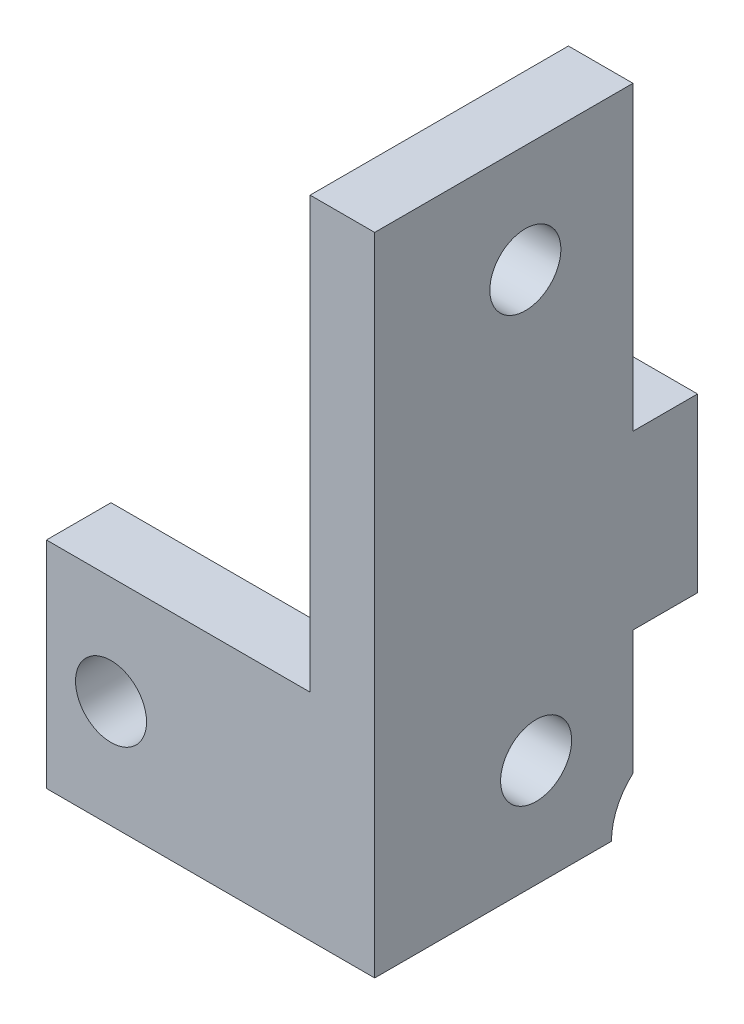
ISO-10303-21;
HEADER;
FILE_DESCRIPTION(('STEP AP214'),'2;1');
FILE_NAME('part.step','',(''),(''),'','','');
FILE_SCHEMA(('AUTOMOTIVE_DESIGN { 1 0 10303 214 1 1 1 1 }'));
ENDSEC;
DATA;
#1=APPLICATION_CONTEXT('core data for automotive mechanical design processes');
#2=APPLICATION_PROTOCOL_DEFINITION('international standard','automotive_design',2000,#1);
#3=PRODUCT_CONTEXT('',#1,'mechanical');
#4=PRODUCT('Part','Part','',(#3));
#5=PRODUCT_RELATED_PRODUCT_CATEGORY('part','',(#4));
#6=PRODUCT_DEFINITION_FORMATION('','',#4);
#7=PRODUCT_DEFINITION_CONTEXT('part definition',#1,'design');
#8=PRODUCT_DEFINITION('design','',#6,#7);
#9=PRODUCT_DEFINITION_SHAPE('','',#8);
#10=(LENGTH_UNIT() NAMED_UNIT(*) SI_UNIT(.MILLI.,.METRE.));
#11=(NAMED_UNIT(*) PLANE_ANGLE_UNIT() SI_UNIT($,.RADIAN.));
#12=(NAMED_UNIT(*) SI_UNIT($,.STERADIAN.) SOLID_ANGLE_UNIT());
#13=UNCERTAINTY_MEASURE_WITH_UNIT(LENGTH_MEASURE(1.E-05),#10,'distance_accuracy_value','');
#14=(GEOMETRIC_REPRESENTATION_CONTEXT(3) GLOBAL_UNCERTAINTY_ASSIGNED_CONTEXT((#13)) GLOBAL_UNIT_ASSIGNED_CONTEXT((#10,
#11,#12)) REPRESENTATION_CONTEXT('',''));
#15=CARTESIAN_POINT('',(0.,0.,0.));
#16=DIRECTION('',(0.,0.,1.));
#17=DIRECTION('',(1.,0.,0.));
#18=AXIS2_PLACEMENT_3D('',#15,#16,#17);
#19=CARTESIAN_POINT('',(-3.00100000000001,25.,-9.));
#20=DIRECTION('',(0.,0.,1.));
#21=DIRECTION('',(0.,-1.,0.));
#22=AXIS2_PLACEMENT_3D('',#19,#20,#21);
#23=PLANE('',#22);
#24=DIRECTION('',(1.,0.,0.));
#25=VECTOR('',#24,1.);
#26=CARTESIAN_POINT('',(-2.75,11.,-9.));
#27=LINE('',#26,#25);
#28=CARTESIAN_POINT('',(9.25,11.,-9.));
#29=VERTEX_POINT('',#28);
#30=CARTESIAN_POINT('',(12.25,11.,-9.));
#31=VERTEX_POINT('',#30);
#32=EDGE_CURVE('E11',#29,#31,#27,.T.);
#33=ORIENTED_EDGE('',*,*,#32,.F.);
#34=DIRECTION('',(0.,-1.,0.));
#35=VECTOR('',#34,1.);
#36=CARTESIAN_POINT('',(9.25,25.,-9.));
#37=LINE('',#36,#35);
#38=CARTESIAN_POINT('',(9.24999999999999,25.,-8.99999999999999));
#39=VERTEX_POINT('',#38);
#40=EDGE_CURVE('E177',#39,#29,#37,.T.);
#41=ORIENTED_EDGE('',*,*,#40,.F.);
#42=DIRECTION('',(1.,0.,0.));
#43=VECTOR('',#42,1.);
#44=CARTESIAN_POINT('',(-3.00100000000001,25.,-9.));
#45=LINE('',#44,#43);
#46=CARTESIAN_POINT('',(12.25,25.,-9.));
#47=VERTEX_POINT('',#46);
#48=EDGE_CURVE('E184',#39,#47,#45,.T.);
#49=ORIENTED_EDGE('',*,*,#48,.T.);
#50=DIRECTION('',(0.,-1.,0.));
#51=VECTOR('',#50,1.);
#52=CARTESIAN_POINT('',(12.25,25.,-9.));
#53=LINE('',#52,#51);
#54=EDGE_CURVE('E181',#47,#31,#53,.T.);
#55=ORIENTED_EDGE('',*,*,#54,.T.);
#56=EDGE_LOOP('',(#33,#41,#49,#55));
#57=FACE_BOUND('',#56,.T.);
#58=ADVANCED_FACE('F41',(#57),#23,.F.);
#59=CARTESIAN_POINT('',(0.,5.,3.));
#60=DIRECTION('',(0.,1.,0.));
#61=DIRECTION('',(-1.,0.,0.));
#62=AXIS2_PLACEMENT_3D('',#59,#60,#61);
#63=PLANE('',#62);
#64=DIRECTION('',(1.,0.,0.));
#65=VECTOR('',#64,1.);
#66=CARTESIAN_POINT('',(0.,5.,3.));
#67=LINE('',#66,#65);
#68=CARTESIAN_POINT('',(-3.,5.,3.));
#69=VERTEX_POINT('',#68);
#70=CARTESIAN_POINT('',(9.25,5.,3.));
#71=VERTEX_POINT('',#70);
#72=EDGE_CURVE('E229',#69,#71,#67,.T.);
#73=ORIENTED_EDGE('',*,*,#72,.T.);
#74=DIRECTION('',(0.,0.,-1.));
#75=VECTOR('',#74,1.);
#76=CARTESIAN_POINT('',(9.25,5.,3.));
#77=LINE('',#76,#75);
#78=CARTESIAN_POINT('',(9.25,5.,0.));
#79=VERTEX_POINT('',#78);
#80=EDGE_CURVE('E203',#71,#79,#77,.T.);
#81=ORIENTED_EDGE('',*,*,#80,.T.);
#82=DIRECTION('',(1.,0.,0.));
#83=VECTOR('',#82,1.);
#84=CARTESIAN_POINT('',(0.,5.,0.));
#85=LINE('',#84,#83);
#86=CARTESIAN_POINT('',(-3.,5.,0.));
#87=VERTEX_POINT('',#86);
#88=EDGE_CURVE('E244',#87,#79,#85,.T.);
#89=ORIENTED_EDGE('',*,*,#88,.F.);
#90=DIRECTION('',(0.,0.,-1.));
#91=VECTOR('',#90,1.);
#92=CARTESIAN_POINT('',(-3.,5.,3.));
#93=LINE('',#92,#91);
#94=EDGE_CURVE('E45',#69,#87,#93,.T.);
#95=ORIENTED_EDGE('',*,*,#94,.F.);
#96=EDGE_LOOP('',(#73,#81,#89,#95));
#97=FACE_BOUND('',#96,.T.);
#98=ADVANCED_FACE('F293',(#97),#63,.T.);
#99=CARTESIAN_POINT('',(-3.,0.,3.));
#100=DIRECTION('',(1.,0.,0.));
#101=DIRECTION('',(0.,1.,0.));
#102=AXIS2_PLACEMENT_3D('',#99,#100,#101);
#103=PLANE('',#102);
#104=DIRECTION('',(0.,-1.,0.));
#105=VECTOR('',#104,1.);
#106=CARTESIAN_POINT('',(-3.,0.,0.));
#107=LINE('',#106,#105);
#108=CARTESIAN_POINT('',(-3.,-5.,0.));
#109=VERTEX_POINT('',#108);
#110=EDGE_CURVE('E246',#87,#109,#107,.T.);
#111=ORIENTED_EDGE('',*,*,#110,.T.);
#112=DIRECTION('',(0.,0.,-1.));
#113=VECTOR('',#112,1.);
#114=CARTESIAN_POINT('',(-3.,-5.,3.));
#115=LINE('',#114,#113);
#116=CARTESIAN_POINT('',(-3.,-5.,3.));
#117=VERTEX_POINT('',#116);
#118=EDGE_CURVE('E238',#117,#109,#115,.T.);
#119=ORIENTED_EDGE('',*,*,#118,.F.);
#120=DIRECTION('',(0.,-1.,0.));
#121=VECTOR('',#120,1.);
#122=CARTESIAN_POINT('',(-3.,0.,3.));
#123=LINE('',#122,#121);
#124=EDGE_CURVE('E232',#69,#117,#123,.T.);
#125=ORIENTED_EDGE('',*,*,#124,.F.);
#126=ORIENTED_EDGE('',*,*,#94,.T.);
#127=EDGE_LOOP('',(#111,#119,#125,#126));
#128=FACE_BOUND('',#127,.T.);
#129=ADVANCED_FACE('F294',(#128),#103,.F.);
#130=CARTESIAN_POINT('',(0.,0.,3.));
#131=DIRECTION('',(0.,0.,-1.));
#132=DIRECTION('',(-1.,0.,0.));
#133=AXIS2_PLACEMENT_3D('',#130,#131,#132);
#134=CYLINDRICAL_SURFACE('',#133,1.65);
#135=CARTESIAN_POINT('',(0.,0.,3.));
#136=DIRECTION('',(0.,0.,1.));
#137=DIRECTION('',(1.,0.,0.));
#138=AXIS2_PLACEMENT_3D('',#135,#136,#137);
#139=CIRCLE('',#138,1.65);
#140=CARTESIAN_POINT('',(1.65,0.,3.));
#141=VERTEX_POINT('',#140);
#142=EDGE_CURVE('E226',#141,#141,#139,.T.);
#143=ORIENTED_EDGE('',*,*,#142,.T.);
#144=EDGE_LOOP('',(#143));
#145=FACE_BOUND('',#144,.T.);
#146=CARTESIAN_POINT('',(0.,0.,0.));
#147=DIRECTION('',(0.,0.,1.));
#148=DIRECTION('',(1.,0.,0.));
#149=AXIS2_PLACEMENT_3D('',#146,#147,#148);
#150=CIRCLE('',#149,1.65);
#151=CARTESIAN_POINT('',(1.65,0.,0.));
#152=VERTEX_POINT('',#151);
#153=EDGE_CURVE('E224',#152,#152,#150,.T.);
#154=ORIENTED_EDGE('',*,*,#153,.F.);
#155=EDGE_LOOP('',(#154));
#156=FACE_BOUND('',#155,.T.);
#157=ADVANCED_FACE('F43',(#145,#156),#134,.F.);
#158=CARTESIAN_POINT('',(0.,-5.,3.));
#159=DIRECTION('',(0.,1.,0.));
#160=DIRECTION('',(-1.,0.,0.));
#161=AXIS2_PLACEMENT_3D('',#158,#159,#160);
#162=PLANE('',#161);
#163=DIRECTION('',(0.,0.,1.));
#164=VECTOR('',#163,1.);
#165=CARTESIAN_POINT('',(9.25,-5.,-11.));
#166=LINE('',#165,#164);
#167=CARTESIAN_POINT('',(9.25000000000001,-5.,-8.));
#168=VERTEX_POINT('',#167);
#169=CARTESIAN_POINT('',(9.25,-5.,0.));
#170=VERTEX_POINT('',#169);
#171=EDGE_CURVE('E221',#168,#170,#166,.T.);
#172=ORIENTED_EDGE('',*,*,#171,.F.);
#173=DIRECTION('',(1.,0.,0.));
#174=VECTOR('',#173,1.);
#175=CARTESIAN_POINT('',(9.25000000000001,-5.,-8.));
#176=LINE('',#175,#174);
#177=CARTESIAN_POINT('',(12.25,-5.,-8.));
#178=VERTEX_POINT('',#177);
#179=EDGE_CURVE('E189',#168,#178,#176,.T.);
#180=ORIENTED_EDGE('',*,*,#179,.T.);
#181=DIRECTION('',(0.,0.,1.));
#182=VECTOR('',#181,1.);
#183=CARTESIAN_POINT('',(12.25,-5.,-11.));
#184=LINE('',#183,#182);
#185=CARTESIAN_POINT('',(12.25,-5.,3.));
#186=VERTEX_POINT('',#185);
#187=EDGE_CURVE('E222',#178,#186,#184,.T.);
#188=ORIENTED_EDGE('',*,*,#187,.T.);
#189=DIRECTION('',(1.,0.,0.));
#190=VECTOR('',#189,1.);
#191=CARTESIAN_POINT('',(0.,-5.,3.));
#192=LINE('',#191,#190);
#193=EDGE_CURVE('E235',#117,#186,#192,.T.);
#194=ORIENTED_EDGE('',*,*,#193,.F.);
#195=ORIENTED_EDGE('',*,*,#118,.T.);
#196=DIRECTION('',(1.,0.,0.));
#197=VECTOR('',#196,1.);
#198=CARTESIAN_POINT('',(0.,-5.,0.));
#199=LINE('',#198,#197);
#200=EDGE_CURVE('E230',#109,#170,#199,.T.);
#201=ORIENTED_EDGE('',*,*,#200,.T.);
#202=EDGE_LOOP('',(#172,#180,#188,#194,#195,#201));
#203=FACE_BOUND('',#202,.T.);
#204=ADVANCED_FACE('F270',(#203),#162,.F.);
#205=CARTESIAN_POINT('',(0.,0.,3.));
#206=DIRECTION('',(0.,0.,1.));
#207=DIRECTION('',(1.,0.,0.));
#208=AXIS2_PLACEMENT_3D('',#205,#206,#207);
#209=PLANE('',#208);
#210=ORIENTED_EDGE('',*,*,#142,.F.);
#211=EDGE_LOOP('',(#210));
#212=FACE_BOUND('',#211,.T.);
#213=ORIENTED_EDGE('',*,*,#193,.T.);
#214=DIRECTION('',(0.,1.,0.));
#215=VECTOR('',#214,1.);
#216=CARTESIAN_POINT('',(12.25,5.,3.));
#217=LINE('',#216,#215);
#218=CARTESIAN_POINT('',(12.25,25.,3.));
#219=VERTEX_POINT('',#218);
#220=EDGE_CURVE('E218',#186,#219,#217,.T.);
#221=ORIENTED_EDGE('',*,*,#220,.T.);
#222=DIRECTION('',(1.,0.,0.));
#223=VECTOR('',#222,1.);
#224=CARTESIAN_POINT('',(9.24999999999999,25.,3.));
#225=LINE('',#224,#223);
#226=CARTESIAN_POINT('',(9.24999999999999,25.,3.));
#227=VERTEX_POINT('',#226);
#228=EDGE_CURVE('E208',#227,#219,#225,.T.);
#229=ORIENTED_EDGE('',*,*,#228,.F.);
#230=DIRECTION('',(0.,-1.,0.));
#231=VECTOR('',#230,1.);
#232=CARTESIAN_POINT('',(9.25,5.,3.));
#233=LINE('',#232,#231);
#234=EDGE_CURVE('E200',#227,#71,#233,.T.);
#235=ORIENTED_EDGE('',*,*,#234,.T.);
#236=ORIENTED_EDGE('',*,*,#72,.F.);
#237=ORIENTED_EDGE('',*,*,#124,.T.);
#238=EDGE_LOOP('',(#213,#221,#229,#235,#236,#237));
#239=FACE_BOUND('',#238,.T.);
#240=ADVANCED_FACE('F289',(#212,#239),#209,.T.);
#241=CARTESIAN_POINT('',(0.,0.,0.));
#242=DIRECTION('',(0.,0.,1.));
#243=DIRECTION('',(1.,0.,0.));
#244=AXIS2_PLACEMENT_3D('',#241,#242,#243);
#245=PLANE('',#244);
#246=ORIENTED_EDGE('',*,*,#153,.T.);
#247=EDGE_LOOP('',(#246));
#248=FACE_BOUND('',#247,.T.);
#249=DIRECTION('',(0.,-1.,0.));
#250=VECTOR('',#249,1.);
#251=CARTESIAN_POINT('',(9.25,0.,0.));
#252=LINE('',#251,#250);
#253=EDGE_CURVE('E241',#79,#170,#252,.T.);
#254=ORIENTED_EDGE('',*,*,#253,.T.);
#255=ORIENTED_EDGE('',*,*,#200,.F.);
#256=ORIENTED_EDGE('',*,*,#110,.F.);
#257=ORIENTED_EDGE('',*,*,#88,.T.);
#258=EDGE_LOOP('',(#254,#255,#256,#257));
#259=FACE_BOUND('',#258,.T.);
#260=ADVANCED_FACE('F296',(#248,#259),#245,.F.);
#261=CARTESIAN_POINT('',(9.25,5.,-11.));
#262=DIRECTION('',(-1.,0.,0.));
#263=DIRECTION('',(0.,-1.,0.));
#264=AXIS2_PLACEMENT_3D('',#261,#262,#263);
#265=PLANE('',#264);
#266=ORIENTED_EDGE('',*,*,#40,.T.);
#267=CARTESIAN_POINT('',(9.25,3.,-9.));
#268=VERTEX_POINT('',#267);
#269=EDGE_CURVE('E180',#29,#268,#37,.T.);
#270=ORIENTED_EDGE('',*,*,#269,.T.);
#271=CARTESIAN_POINT('',(9.25000000000001,-2.76393202250021,-9.));
#272=VERTEX_POINT('',#271);
#273=EDGE_CURVE('E176',#268,#272,#37,.T.);
#274=ORIENTED_EDGE('',*,*,#273,.T.);
#275=CARTESIAN_POINT('',(9.25000000000001,-5.,-11.));
#276=DIRECTION('',(1.,0.,0.));
#277=DIRECTION('',(0.,-1.,0.));
#278=AXIS2_PLACEMENT_3D('',#275,#276,#277);
#279=CIRCLE('',#278,3.);
#280=EDGE_CURVE('E187',#272,#168,#279,.T.);
#281=ORIENTED_EDGE('',*,*,#280,.T.);
#282=ORIENTED_EDGE('',*,*,#171,.T.);
#283=ORIENTED_EDGE('',*,*,#253,.F.);
#284=ORIENTED_EDGE('',*,*,#80,.F.);
#285=ORIENTED_EDGE('',*,*,#234,.F.);
#286=DIRECTION('',(0.,0.,1.));
#287=VECTOR('',#286,1.);
#288=CARTESIAN_POINT('',(9.24999999999999,25.,3.));
#289=LINE('',#288,#287);
#290=EDGE_CURVE('E206',#39,#227,#289,.T.);
#291=ORIENTED_EDGE('',*,*,#290,.F.);
#292=EDGE_LOOP('',(#266,#270,#274,#281,#282,#283,#284,#285,#291));
#293=FACE_BOUND('',#292,.T.);
#294=CARTESIAN_POINT('',(9.25,0.,-4.5));
#295=DIRECTION('',(-1.,0.,0.));
#296=DIRECTION('',(0.,-1.,0.));
#297=AXIS2_PLACEMENT_3D('',#294,#295,#296);
#298=CIRCLE('',#297,1.65);
#299=CARTESIAN_POINT('',(9.25,-1.65,-4.5));
#300=VERTEX_POINT('',#299);
#301=EDGE_CURVE('E215',#300,#300,#298,.T.);
#302=ORIENTED_EDGE('',*,*,#301,.F.);
#303=EDGE_LOOP('',(#302));
#304=FACE_BOUND('',#303,.T.);
#305=CARTESIAN_POINT('',(9.24999999999999,20.,-4.));
#306=DIRECTION('',(1.,0.,0.));
#307=DIRECTION('',(0.,1.,0.));
#308=AXIS2_PLACEMENT_3D('',#305,#306,#307);
#309=CIRCLE('',#308,1.65);
#310=CARTESIAN_POINT('',(9.24999999999999,21.65,-4.));
#311=VERTEX_POINT('',#310);
#312=EDGE_CURVE('E194',#311,#311,#309,.T.);
#313=ORIENTED_EDGE('',*,*,#312,.T.);
#314=EDGE_LOOP('',(#313));
#315=FACE_BOUND('',#314,.T.);
#316=ADVANCED_FACE('F273',(#293,#304,#315),#265,.T.);
#317=CARTESIAN_POINT('',(12.25,5.,-11.));
#318=DIRECTION('',(1.,0.,0.));
#319=DIRECTION('',(0.,1.,0.));
#320=AXIS2_PLACEMENT_3D('',#317,#318,#319);
#321=PLANE('',#320);
#322=ORIENTED_EDGE('',*,*,#54,.F.);
#323=DIRECTION('',(0.,0.,1.));
#324=VECTOR('',#323,1.);
#325=CARTESIAN_POINT('',(12.25,25.,3.));
#326=LINE('',#325,#324);
#327=EDGE_CURVE('E197',#47,#219,#326,.T.);
#328=ORIENTED_EDGE('',*,*,#327,.T.);
#329=ORIENTED_EDGE('',*,*,#220,.F.);
#330=ORIENTED_EDGE('',*,*,#187,.F.);
#331=CARTESIAN_POINT('',(12.25,-5.,-11.));
#332=DIRECTION('',(1.,0.,0.));
#333=DIRECTION('',(0.,-1.,0.));
#334=AXIS2_PLACEMENT_3D('',#331,#332,#333);
#335=CIRCLE('',#334,3.);
#336=CARTESIAN_POINT('',(12.25,-2.76393202250021,-9.));
#337=VERTEX_POINT('',#336);
#338=EDGE_CURVE('E186',#337,#178,#335,.T.);
#339=ORIENTED_EDGE('',*,*,#338,.F.);
#340=CARTESIAN_POINT('',(12.25,3.,-9.));
#341=VERTEX_POINT('',#340);
#342=EDGE_CURVE('E66',#341,#337,#53,.T.);
#343=ORIENTED_EDGE('',*,*,#342,.F.);
#344=DIRECTION('',(0.,0.,-1.));
#345=VECTOR('',#344,1.);
#346=CARTESIAN_POINT('',(12.25,3.,-9.));
#347=LINE('',#346,#345);
#348=CARTESIAN_POINT('',(12.25,3.,-12.));
#349=VERTEX_POINT('',#348);
#350=EDGE_CURVE('E59',#341,#349,#347,.T.);
#351=ORIENTED_EDGE('',*,*,#350,.T.);
#352=DIRECTION('',(0.,1.,0.));
#353=VECTOR('',#352,1.);
#354=CARTESIAN_POINT('',(12.25,11.,-12.));
#355=LINE('',#354,#353);
#356=CARTESIAN_POINT('',(12.25,11.,-12.));
#357=VERTEX_POINT('',#356);
#358=EDGE_CURVE('E163',#349,#357,#355,.T.);
#359=ORIENTED_EDGE('',*,*,#358,.T.);
#360=DIRECTION('',(0.,0.,1.));
#361=VECTOR('',#360,1.);
#362=CARTESIAN_POINT('',(12.25,11.,-9.));
#363=LINE('',#362,#361);
#364=EDGE_CURVE('E160',#357,#31,#363,.T.);
#365=ORIENTED_EDGE('',*,*,#364,.T.);
#366=EDGE_LOOP('',(#322,#328,#329,#330,#339,#343,#351,#359,#365));
#367=FACE_BOUND('',#366,.T.);
#368=CARTESIAN_POINT('',(12.25,0.,-4.5));
#369=DIRECTION('',(1.,0.,0.));
#370=DIRECTION('',(0.,1.,0.));
#371=AXIS2_PLACEMENT_3D('',#368,#369,#370);
#372=CIRCLE('',#371,1.65);
#373=CARTESIAN_POINT('',(12.25,1.65000000000001,-4.5));
#374=VERTEX_POINT('',#373);
#375=EDGE_CURVE('E212',#374,#374,#372,.T.);
#376=ORIENTED_EDGE('',*,*,#375,.F.);
#377=EDGE_LOOP('',(#376));
#378=FACE_BOUND('',#377,.T.);
#379=CARTESIAN_POINT('',(12.25,20.,-4.));
#380=DIRECTION('',(1.,0.,0.));
#381=DIRECTION('',(0.,1.,0.));
#382=AXIS2_PLACEMENT_3D('',#379,#380,#381);
#383=CIRCLE('',#382,1.65);
#384=CARTESIAN_POINT('',(12.25,21.65,-4.));
#385=VERTEX_POINT('',#384);
#386=EDGE_CURVE('E193',#385,#385,#383,.T.);
#387=ORIENTED_EDGE('',*,*,#386,.F.);
#388=EDGE_LOOP('',(#387));
#389=FACE_BOUND('',#388,.T.);
#390=ADVANCED_FACE('F261',(#367,#378,#389),#321,.T.);
#391=CARTESIAN_POINT('',(2.25,0.,-4.5));
#392=DIRECTION('',(1.,0.,0.));
#393=DIRECTION('',(0.,1.,0.));
#394=AXIS2_PLACEMENT_3D('',#391,#392,#393);
#395=CYLINDRICAL_SURFACE('',#394,1.65);
#396=ORIENTED_EDGE('',*,*,#301,.T.);
#397=EDGE_LOOP('',(#396));
#398=FACE_BOUND('',#397,.T.);
#399=ORIENTED_EDGE('',*,*,#375,.T.);
#400=EDGE_LOOP('',(#399));
#401=FACE_BOUND('',#400,.T.);
#402=ADVANCED_FACE('F332',(#398,#401),#395,.F.);
#403=CARTESIAN_POINT('',(9.24999999999999,25.,3.));
#404=DIRECTION('',(0.,1.,0.));
#405=DIRECTION('',(-1.,0.,0.));
#406=AXIS2_PLACEMENT_3D('',#403,#404,#405);
#407=PLANE('',#406);
#408=ORIENTED_EDGE('',*,*,#48,.F.);
#409=ORIENTED_EDGE('',*,*,#290,.T.);
#410=ORIENTED_EDGE('',*,*,#228,.T.);
#411=ORIENTED_EDGE('',*,*,#327,.F.);
#412=EDGE_LOOP('',(#408,#409,#410,#411));
#413=FACE_BOUND('',#412,.T.);
#414=ADVANCED_FACE('F285',(#413),#407,.T.);
#415=CARTESIAN_POINT('',(9.24999999999999,20.,-4.));
#416=DIRECTION('',(1.,0.,0.));
#417=DIRECTION('',(0.,1.,0.));
#418=AXIS2_PLACEMENT_3D('',#415,#416,#417);
#419=CYLINDRICAL_SURFACE('',#418,1.65);
#420=ORIENTED_EDGE('',*,*,#312,.F.);
#421=EDGE_LOOP('',(#420));
#422=FACE_BOUND('',#421,.T.);
#423=ORIENTED_EDGE('',*,*,#386,.T.);
#424=EDGE_LOOP('',(#423));
#425=FACE_BOUND('',#424,.T.);
#426=ADVANCED_FACE('F323',(#422,#425),#419,.F.);
#427=CARTESIAN_POINT('',(9.25000000000001,-5.,-11.));
#428=DIRECTION('',(1.,0.,0.));
#429=DIRECTION('',(0.,1.,0.));
#430=AXIS2_PLACEMENT_3D('',#427,#428,#429);
#431=CYLINDRICAL_SURFACE('',#430,3.);
#432=ORIENTED_EDGE('',*,*,#280,.F.);
#433=DIRECTION('',(1.,0.,0.));
#434=VECTOR('',#433,1.);
#435=CARTESIAN_POINT('',(9.25000000000001,-2.76393202250021,-9.));
#436=LINE('',#435,#434);
#437=EDGE_CURVE('E171',#337,#272,#436,.F.);
#438=ORIENTED_EDGE('',*,*,#437,.F.);
#439=ORIENTED_EDGE('',*,*,#338,.T.);
#440=ORIENTED_EDGE('',*,*,#179,.F.);
#441=EDGE_LOOP('',(#432,#438,#439,#440));
#442=FACE_BOUND('',#441,.T.);
#443=ADVANCED_FACE('F268',(#442),#431,.F.);
#444=ORIENTED_EDGE('',*,*,#273,.F.);
#445=DIRECTION('',(1.,0.,0.));
#446=VECTOR('',#445,1.);
#447=CARTESIAN_POINT('',(-2.75,3.,-9.));
#448=LINE('',#447,#446);
#449=EDGE_CURVE('E50',#268,#341,#448,.T.);
#450=ORIENTED_EDGE('',*,*,#449,.T.);
#451=ORIENTED_EDGE('',*,*,#342,.T.);
#452=ORIENTED_EDGE('',*,*,#437,.T.);
#453=EDGE_LOOP('',(#444,#450,#451,#452));
#454=FACE_BOUND('',#453,.T.);
#455=ADVANCED_FACE('F256',(#454),#23,.F.);
#456=CARTESIAN_POINT('',(-2.75,11.,-9.));
#457=DIRECTION('',(0.,0.,1.));
#458=DIRECTION('',(0.,-1.,0.));
#459=AXIS2_PLACEMENT_3D('',#456,#457,#458);
#460=PLANE('',#459);
#461=ORIENTED_EDGE('',*,*,#269,.F.);
#462=CARTESIAN_POINT('',(-2.75,11.,-9.));
#463=VERTEX_POINT('',#462);
#464=EDGE_CURVE('E52',#463,#29,#27,.T.);
#465=ORIENTED_EDGE('',*,*,#464,.F.);
#466=DIRECTION('',(0.,-1.,0.));
#467=VECTOR('',#466,1.);
#468=CARTESIAN_POINT('',(-2.75,11.,-9.));
#469=LINE('',#468,#467);
#470=CARTESIAN_POINT('',(-2.75,3.,-9.));
#471=VERTEX_POINT('',#470);
#472=EDGE_CURVE('E153',#463,#471,#469,.T.);
#473=ORIENTED_EDGE('',*,*,#472,.T.);
#474=EDGE_CURVE('E138',#471,#268,#448,.T.);
#475=ORIENTED_EDGE('',*,*,#474,.T.);
#476=EDGE_LOOP('',(#461,#465,#473,#475));
#477=FACE_BOUND('',#476,.T.);
#478=ADVANCED_FACE('F158',(#477),#460,.T.);
#479=CARTESIAN_POINT('',(-2.75,11.,-9.));
#480=DIRECTION('',(0.,1.,0.));
#481=DIRECTION('',(-1.,0.,0.));
#482=AXIS2_PLACEMENT_3D('',#479,#480,#481);
#483=PLANE('',#482);
#484=ORIENTED_EDGE('',*,*,#364,.F.);
#485=DIRECTION('',(1.,0.,0.));
#486=VECTOR('',#485,1.);
#487=CARTESIAN_POINT('',(-2.75,11.,-12.));
#488=LINE('',#487,#486);
#489=CARTESIAN_POINT('',(-2.75,11.,-12.));
#490=VERTEX_POINT('',#489);
#491=EDGE_CURVE('E172',#490,#357,#488,.T.);
#492=ORIENTED_EDGE('',*,*,#491,.F.);
#493=DIRECTION('',(0.,0.,1.));
#494=VECTOR('',#493,1.);
#495=CARTESIAN_POINT('',(-2.75,11.,-9.));
#496=LINE('',#495,#494);
#497=EDGE_CURVE('E146',#490,#463,#496,.T.);
#498=ORIENTED_EDGE('',*,*,#497,.T.);
#499=ORIENTED_EDGE('',*,*,#464,.T.);
#500=ORIENTED_EDGE('',*,*,#32,.T.);
#501=EDGE_LOOP('',(#484,#492,#498,#499,#500));
#502=FACE_BOUND('',#501,.T.);
#503=ADVANCED_FACE('F280',(#502),#483,.T.);
#504=CARTESIAN_POINT('',(-2.75,11.,-12.));
#505=DIRECTION('',(0.,0.,-1.));
#506=DIRECTION('',(0.,1.,0.));
#507=AXIS2_PLACEMENT_3D('',#504,#505,#506);
#508=PLANE('',#507);
#509=ORIENTED_EDGE('',*,*,#358,.F.);
#510=DIRECTION('',(1.,0.,0.));
#511=VECTOR('',#510,1.);
#512=CARTESIAN_POINT('',(-2.75,3.,-12.));
#513=LINE('',#512,#511);
#514=CARTESIAN_POINT('',(-2.75,3.,-12.));
#515=VERTEX_POINT('',#514);
#516=EDGE_CURVE('E145',#515,#349,#513,.T.);
#517=ORIENTED_EDGE('',*,*,#516,.F.);
#518=DIRECTION('',(0.,1.,0.));
#519=VECTOR('',#518,1.);
#520=CARTESIAN_POINT('',(-2.75,11.,-12.));
#521=LINE('',#520,#519);
#522=EDGE_CURVE('E156',#515,#490,#521,.T.);
#523=ORIENTED_EDGE('',*,*,#522,.T.);
#524=ORIENTED_EDGE('',*,*,#491,.T.);
#525=EDGE_LOOP('',(#509,#517,#523,#524));
#526=FACE_BOUND('',#525,.T.);
#527=ADVANCED_FACE('F396',(#526),#508,.T.);
#528=CARTESIAN_POINT('',(-2.75,3.,-9.));
#529=DIRECTION('',(0.,-1.,0.));
#530=DIRECTION('',(1.,0.,0.));
#531=AXIS2_PLACEMENT_3D('',#528,#529,#530);
#532=PLANE('',#531);
#533=ORIENTED_EDGE('',*,*,#350,.F.);
#534=ORIENTED_EDGE('',*,*,#449,.F.);
#535=ORIENTED_EDGE('',*,*,#474,.F.);
#536=DIRECTION('',(0.,0.,-1.));
#537=VECTOR('',#536,1.);
#538=CARTESIAN_POINT('',(-2.75,3.,-9.));
#539=LINE('',#538,#537);
#540=EDGE_CURVE('E141',#471,#515,#539,.T.);
#541=ORIENTED_EDGE('',*,*,#540,.T.);
#542=ORIENTED_EDGE('',*,*,#516,.T.);
#543=EDGE_LOOP('',(#533,#534,#535,#541,#542));
#544=FACE_BOUND('',#543,.T.);
#545=ADVANCED_FACE('F140',(#544),#532,.T.);
#546=CARTESIAN_POINT('',(-2.75,0.,0.));
#547=DIRECTION('',(1.,0.,0.));
#548=DIRECTION('',(0.,1.,0.));
#549=AXIS2_PLACEMENT_3D('',#546,#547,#548);
#550=PLANE('',#549);
#551=ORIENTED_EDGE('',*,*,#472,.F.);
#552=ORIENTED_EDGE('',*,*,#497,.F.);
#553=ORIENTED_EDGE('',*,*,#522,.F.);
#554=ORIENTED_EDGE('',*,*,#540,.F.);
#555=EDGE_LOOP('',(#551,#552,#553,#554));
#556=FACE_BOUND('',#555,.T.);
#557=ADVANCED_FACE('F151',(#556),#550,.F.);
#558=CLOSED_SHELL('',(#58,#98,#129,#157,#204,#240,#260,#316,#390,#402,#414,#426,#443,#455,#478,
#503,#527,#545,#557));
#559=MANIFOLD_SOLID_BREP('B2',#558);
#560=ADVANCED_BREP_SHAPE_REPRESENTATION('',(#18,#559),#14);
#561=SHAPE_DEFINITION_REPRESENTATION(#9,#560);
ENDSEC;
END-ISO-10303-21;
